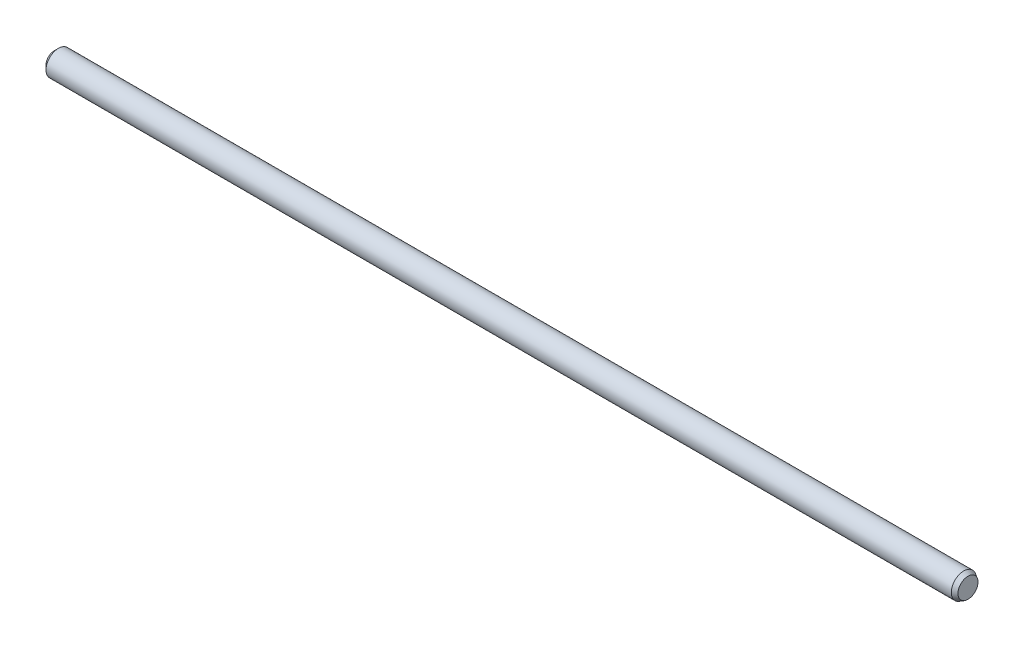
ISO-10303-21;
HEADER;
FILE_DESCRIPTION(('STEP AP214'),'2;1');
FILE_NAME('part.step','',(''),(''),'','','');
FILE_SCHEMA(('AUTOMOTIVE_DESIGN { 1 0 10303 214 1 1 1 1 }'));
ENDSEC;
DATA;
#1=APPLICATION_CONTEXT('core data for automotive mechanical design processes');
#2=APPLICATION_PROTOCOL_DEFINITION('international standard','automotive_design',2000,#1);
#3=PRODUCT_CONTEXT('',#1,'mechanical');
#4=PRODUCT('Part','Part','',(#3));
#5=PRODUCT_RELATED_PRODUCT_CATEGORY('part','',(#4));
#6=PRODUCT_DEFINITION_FORMATION('','',#4);
#7=PRODUCT_DEFINITION_CONTEXT('part definition',#1,'design');
#8=PRODUCT_DEFINITION('design','',#6,#7);
#9=PRODUCT_DEFINITION_SHAPE('','',#8);
#10=(LENGTH_UNIT() NAMED_UNIT(*) SI_UNIT(.MILLI.,.METRE.));
#11=(NAMED_UNIT(*) PLANE_ANGLE_UNIT() SI_UNIT($,.RADIAN.));
#12=(NAMED_UNIT(*) SI_UNIT($,.STERADIAN.) SOLID_ANGLE_UNIT());
#13=UNCERTAINTY_MEASURE_WITH_UNIT(LENGTH_MEASURE(1.E-05),#10,'distance_accuracy_value','');
#14=(GEOMETRIC_REPRESENTATION_CONTEXT(3) GLOBAL_UNCERTAINTY_ASSIGNED_CONTEXT((#13)) GLOBAL_UNIT_ASSIGNED_CONTEXT((#10,
#11,#12)) REPRESENTATION_CONTEXT('',''));
#15=CARTESIAN_POINT('',(0.,0.,0.));
#16=DIRECTION('',(0.,0.,1.));
#17=DIRECTION('',(1.,0.,0.));
#18=AXIS2_PLACEMENT_3D('',#15,#16,#17);
#19=CARTESIAN_POINT('',(108.,0.,0.));
#20=DIRECTION('',(-1.,0.,0.));
#21=DIRECTION('',(0.,0.,1.));
#22=AXIS2_PLACEMENT_3D('',#19,#20,#21);
#23=CYLINDRICAL_SURFACE('',#22,1.475);
#24=CARTESIAN_POINT('',(0.499999999999973,0.,0.));
#25=DIRECTION('',(1.,0.,0.));
#26=DIRECTION('',(0.,0.,-1.));
#27=AXIS2_PLACEMENT_3D('',#24,#25,#26);
#28=CIRCLE('',#27,1.475);
#29=CARTESIAN_POINT('',(0.499999999999973,0.,-1.475));
#30=VERTEX_POINT('',#29);
#31=EDGE_CURVE('E40',#30,#30,#28,.T.);
#32=ORIENTED_EDGE('',*,*,#31,.T.);
#33=EDGE_LOOP('',(#32));
#34=FACE_BOUND('',#33,.T.);
#35=CARTESIAN_POINT('',(107.5,0.,0.));
#36=DIRECTION('',(1.,0.,0.));
#37=DIRECTION('',(0.,0.,-1.));
#38=AXIS2_PLACEMENT_3D('',#35,#36,#37);
#39=CIRCLE('',#38,1.475);
#40=CARTESIAN_POINT('',(107.5,0.,-1.475));
#41=VERTEX_POINT('',#40);
#42=EDGE_CURVE('E44',#41,#41,#39,.F.);
#43=ORIENTED_EDGE('',*,*,#42,.T.);
#44=EDGE_LOOP('',(#43));
#45=FACE_BOUND('',#44,.T.);
#46=ADVANCED_FACE('F33',(#34,#45),#23,.T.);
#47=CARTESIAN_POINT('',(108.,0.,0.));
#48=DIRECTION('',(1.,0.,0.));
#49=DIRECTION('',(0.,0.,-1.));
#50=AXIS2_PLACEMENT_3D('',#47,#48,#49);
#51=PLANE('',#50);
#52=CARTESIAN_POINT('',(108.,0.,0.));
#53=DIRECTION('',(1.,0.,0.));
#54=DIRECTION('',(0.,0.,-1.));
#55=AXIS2_PLACEMENT_3D('',#52,#53,#54);
#56=CIRCLE('',#55,1.18632486540518);
#57=CARTESIAN_POINT('',(108.,0.,-1.18632486540518));
#58=VERTEX_POINT('',#57);
#59=EDGE_CURVE('E48',#58,#58,#56,.T.);
#60=ORIENTED_EDGE('',*,*,#59,.T.);
#61=EDGE_LOOP('',(#60));
#62=FACE_BOUND('',#61,.T.);
#63=ADVANCED_FACE('F54',(#62),#51,.T.);
#64=CARTESIAN_POINT('',(0.,0.,0.));
#65=DIRECTION('',(1.,0.,0.));
#66=DIRECTION('',(0.,0.,-1.));
#67=AXIS2_PLACEMENT_3D('',#64,#65,#66);
#68=PLANE('',#67);
#69=CARTESIAN_POINT('',(0.,0.,0.));
#70=DIRECTION('',(1.,0.,0.));
#71=DIRECTION('',(0.,0.,-1.));
#72=AXIS2_PLACEMENT_3D('',#69,#70,#71);
#73=CIRCLE('',#72,0.975000000000031);
#74=CARTESIAN_POINT('',(0.,0.,-0.975000000000031));
#75=VERTEX_POINT('',#74);
#76=EDGE_CURVE('E10',#75,#75,#73,.F.);
#77=ORIENTED_EDGE('',*,*,#76,.T.);
#78=EDGE_LOOP('',(#77));
#79=FACE_BOUND('',#78,.T.);
#80=ADVANCED_FACE('F58',(#79),#68,.F.);
#81=CARTESIAN_POINT('',(108.,0.,0.));
#82=DIRECTION('',(-1.,0.,0.));
#83=DIRECTION('',(0.,0.,1.));
#84=AXIS2_PLACEMENT_3D('',#81,#82,#83);
#85=CONICAL_SURFACE('',#84,1.18632486540518,0.523598775598284);
#86=ORIENTED_EDGE('',*,*,#42,.F.);
#87=EDGE_LOOP('',(#86));
#88=FACE_BOUND('',#87,.T.);
#89=ORIENTED_EDGE('',*,*,#59,.F.);
#90=EDGE_LOOP('',(#89));
#91=FACE_BOUND('',#90,.T.);
#92=ADVANCED_FACE('F56',(#88,#91),#85,.T.);
#93=CARTESIAN_POINT('',(0.499999999999973,0.,0.));
#94=DIRECTION('',(1.,0.,0.));
#95=DIRECTION('',(0.,0.,-1.));
#96=AXIS2_PLACEMENT_3D('',#93,#94,#95);
#97=CONICAL_SURFACE('',#96,1.475,0.785398163397444);
#98=ORIENTED_EDGE('',*,*,#76,.F.);
#99=EDGE_LOOP('',(#98));
#100=FACE_BOUND('',#99,.T.);
#101=ORIENTED_EDGE('',*,*,#31,.F.);
#102=EDGE_LOOP('',(#101));
#103=FACE_BOUND('',#102,.T.);
#104=ADVANCED_FACE('F35',(#100,#103),#97,.T.);
#105=CLOSED_SHELL('',(#46,#63,#80,#92,#104));
#106=MANIFOLD_SOLID_BREP('B2',#105);
#107=ADVANCED_BREP_SHAPE_REPRESENTATION('',(#18,#106),#14);
#108=SHAPE_DEFINITION_REPRESENTATION(#9,#107);
ENDSEC;
END-ISO-10303-21;
